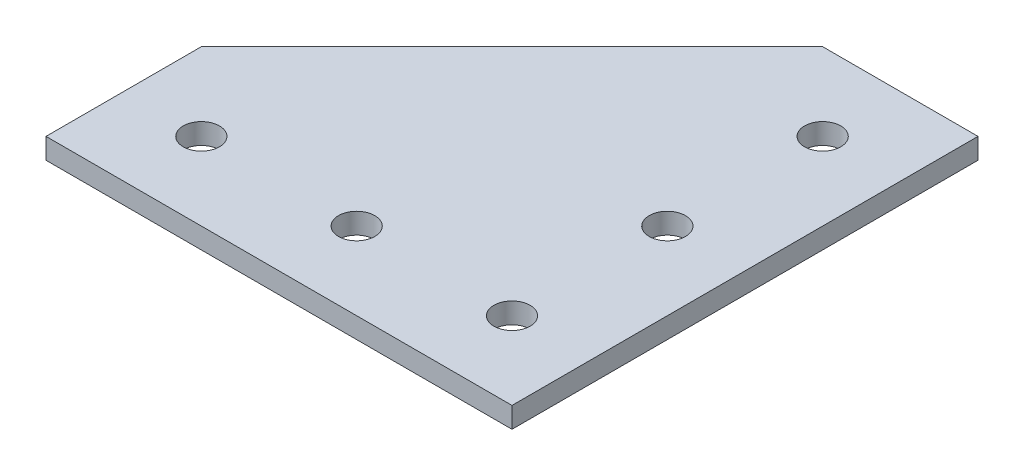
ISO-10303-21;
HEADER;
FILE_DESCRIPTION(('STEP AP214'),'2;1');
FILE_NAME('part.step','',(''),(''),'','','');
FILE_SCHEMA(('AUTOMOTIVE_DESIGN { 1 0 10303 214 1 1 1 1 }'));
ENDSEC;
DATA;
#1=APPLICATION_CONTEXT('core data for automotive mechanical design processes');
#2=APPLICATION_PROTOCOL_DEFINITION('international standard','automotive_design',2000,#1);
#3=PRODUCT_CONTEXT('',#1,'mechanical');
#4=PRODUCT('Part','Part','',(#3));
#5=PRODUCT_RELATED_PRODUCT_CATEGORY('part','',(#4));
#6=PRODUCT_DEFINITION_FORMATION('','',#4);
#7=PRODUCT_DEFINITION_CONTEXT('part definition',#1,'design');
#8=PRODUCT_DEFINITION('design','',#6,#7);
#9=PRODUCT_DEFINITION_SHAPE('','',#8);
#10=(LENGTH_UNIT() NAMED_UNIT(*) SI_UNIT(.MILLI.,.METRE.));
#11=(NAMED_UNIT(*) PLANE_ANGLE_UNIT() SI_UNIT($,.RADIAN.));
#12=(NAMED_UNIT(*) SI_UNIT($,.STERADIAN.) SOLID_ANGLE_UNIT());
#13=UNCERTAINTY_MEASURE_WITH_UNIT(LENGTH_MEASURE(1.E-05),#10,'distance_accuracy_value','');
#14=(GEOMETRIC_REPRESENTATION_CONTEXT(3) GLOBAL_UNCERTAINTY_ASSIGNED_CONTEXT((#13)) GLOBAL_UNIT_ASSIGNED_CONTEXT((#10,
#11,#12)) REPRESENTATION_CONTEXT('',''));
#15=CARTESIAN_POINT('',(0.,0.,0.));
#16=DIRECTION('',(0.,0.,1.));
#17=DIRECTION('',(1.,0.,0.));
#18=AXIS2_PLACEMENT_3D('',#15,#16,#17);
#19=CARTESIAN_POINT('',(-90.,4.,-30.));
#20=DIRECTION('',(0.707106781186548,0.,0.707106781186547));
#21=DIRECTION('',(0.707106781186547,0.,-0.707106781186548));
#22=AXIS2_PLACEMENT_3D('',#19,#20,#21);
#23=PLANE('',#22);
#24=DIRECTION('',(-0.707106781186547,0.,0.707106781186548));
#25=VECTOR('',#24,1.);
#26=CARTESIAN_POINT('',(-90.,0.,-30.));
#27=LINE('',#26,#25);
#28=CARTESIAN_POINT('',(-30.,0.,-90.));
#29=VERTEX_POINT('',#28);
#30=CARTESIAN_POINT('',(-90.,0.,-30.));
#31=VERTEX_POINT('',#30);
#32=EDGE_CURVE('E111',#29,#31,#27,.T.);
#33=ORIENTED_EDGE('',*,*,#32,.T.);
#34=DIRECTION('',(0.,-1.,0.));
#35=VECTOR('',#34,1.);
#36=CARTESIAN_POINT('',(-90.,4.,-30.));
#37=LINE('',#36,#35);
#38=CARTESIAN_POINT('',(-90.,4.,-30.));
#39=VERTEX_POINT('',#38);
#40=EDGE_CURVE('E11',#39,#31,#37,.T.);
#41=ORIENTED_EDGE('',*,*,#40,.F.);
#42=DIRECTION('',(-0.707106781186547,0.,0.707106781186548));
#43=VECTOR('',#42,1.);
#44=CARTESIAN_POINT('',(-90.,4.,-30.));
#45=LINE('',#44,#43);
#46=CARTESIAN_POINT('',(-30.,4.,-90.));
#47=VERTEX_POINT('',#46);
#48=EDGE_CURVE('E120',#47,#39,#45,.T.);
#49=ORIENTED_EDGE('',*,*,#48,.F.);
#50=DIRECTION('',(0.,-1.,0.));
#51=VECTOR('',#50,1.);
#52=CARTESIAN_POINT('',(-30.,4.,-90.));
#53=LINE('',#52,#51);
#54=EDGE_CURVE('E107',#47,#29,#53,.T.);
#55=ORIENTED_EDGE('',*,*,#54,.T.);
#56=EDGE_LOOP('',(#33,#41,#49,#55));
#57=FACE_BOUND('',#56,.T.);
#58=ADVANCED_FACE('F37',(#57),#23,.F.);
#59=CARTESIAN_POINT('',(-90.,4.,0.));
#60=DIRECTION('',(1.,0.,0.));
#61=DIRECTION('',(0.,0.,-1.));
#62=AXIS2_PLACEMENT_3D('',#59,#60,#61);
#63=PLANE('',#62);
#64=DIRECTION('',(0.,0.,1.));
#65=VECTOR('',#64,1.);
#66=CARTESIAN_POINT('',(-90.,0.,0.));
#67=LINE('',#66,#65);
#68=CARTESIAN_POINT('',(-90.,0.,0.));
#69=VERTEX_POINT('',#68);
#70=EDGE_CURVE('E114',#31,#69,#67,.T.);
#71=ORIENTED_EDGE('',*,*,#70,.T.);
#72=DIRECTION('',(0.,-1.,0.));
#73=VECTOR('',#72,1.);
#74=CARTESIAN_POINT('',(-90.,4.,0.));
#75=LINE('',#74,#73);
#76=CARTESIAN_POINT('',(-90.,4.,0.));
#77=VERTEX_POINT('',#76);
#78=EDGE_CURVE('E45',#77,#69,#75,.T.);
#79=ORIENTED_EDGE('',*,*,#78,.F.);
#80=DIRECTION('',(0.,0.,1.));
#81=VECTOR('',#80,1.);
#82=CARTESIAN_POINT('',(-90.,4.,0.));
#83=LINE('',#82,#81);
#84=EDGE_CURVE('E87',#39,#77,#83,.T.);
#85=ORIENTED_EDGE('',*,*,#84,.F.);
#86=ORIENTED_EDGE('',*,*,#40,.T.);
#87=EDGE_LOOP('',(#71,#79,#85,#86));
#88=FACE_BOUND('',#87,.T.);
#89=ADVANCED_FACE('F140',(#88),#63,.F.);
#90=CARTESIAN_POINT('',(0.,4.,0.));
#91=DIRECTION('',(0.,0.,-1.));
#92=DIRECTION('',(-1.,0.,0.));
#93=AXIS2_PLACEMENT_3D('',#90,#91,#92);
#94=PLANE('',#93);
#95=DIRECTION('',(1.,0.,0.));
#96=VECTOR('',#95,1.);
#97=CARTESIAN_POINT('',(0.,0.,0.));
#98=LINE('',#97,#96);
#99=CARTESIAN_POINT('',(0.,0.,0.));
#100=VERTEX_POINT('',#99);
#101=EDGE_CURVE('E102',#69,#100,#98,.T.);
#102=ORIENTED_EDGE('',*,*,#101,.T.);
#103=DIRECTION('',(0.,-1.,0.));
#104=VECTOR('',#103,1.);
#105=CARTESIAN_POINT('',(0.,4.,0.));
#106=LINE('',#105,#104);
#107=CARTESIAN_POINT('',(0.,4.,0.));
#108=VERTEX_POINT('',#107);
#109=EDGE_CURVE('E99',#108,#100,#106,.T.);
#110=ORIENTED_EDGE('',*,*,#109,.F.);
#111=DIRECTION('',(1.,0.,0.));
#112=VECTOR('',#111,1.);
#113=CARTESIAN_POINT('',(0.,4.,0.));
#114=LINE('',#113,#112);
#115=EDGE_CURVE('E91',#77,#108,#114,.T.);
#116=ORIENTED_EDGE('',*,*,#115,.F.);
#117=ORIENTED_EDGE('',*,*,#78,.T.);
#118=EDGE_LOOP('',(#102,#110,#116,#117));
#119=FACE_BOUND('',#118,.T.);
#120=ADVANCED_FACE('F100',(#119),#94,.F.);
#121=CARTESIAN_POINT('',(0.,4.,0.));
#122=DIRECTION('',(-1.,0.,0.));
#123=DIRECTION('',(0.,0.,1.));
#124=AXIS2_PLACEMENT_3D('',#121,#122,#123);
#125=PLANE('',#124);
#126=DIRECTION('',(0.,0.,-1.));
#127=VECTOR('',#126,1.);
#128=CARTESIAN_POINT('',(0.,0.,0.));
#129=LINE('',#128,#127);
#130=CARTESIAN_POINT('',(0.,0.,-90.));
#131=VERTEX_POINT('',#130);
#132=EDGE_CURVE('E73',#100,#131,#129,.T.);
#133=ORIENTED_EDGE('',*,*,#132,.T.);
#134=DIRECTION('',(0.,-1.,0.));
#135=VECTOR('',#134,1.);
#136=CARTESIAN_POINT('',(0.,4.,-90.));
#137=LINE('',#136,#135);
#138=CARTESIAN_POINT('',(0.,4.,-90.));
#139=VERTEX_POINT('',#138);
#140=EDGE_CURVE('E103',#139,#131,#137,.T.);
#141=ORIENTED_EDGE('',*,*,#140,.F.);
#142=DIRECTION('',(0.,0.,-1.));
#143=VECTOR('',#142,1.);
#144=CARTESIAN_POINT('',(0.,4.,0.));
#145=LINE('',#144,#143);
#146=EDGE_CURVE('E95',#108,#139,#145,.T.);
#147=ORIENTED_EDGE('',*,*,#146,.F.);
#148=ORIENTED_EDGE('',*,*,#109,.T.);
#149=EDGE_LOOP('',(#133,#141,#147,#148));
#150=FACE_BOUND('',#149,.T.);
#151=ADVANCED_FACE('F105',(#150),#125,.F.);
#152=CARTESIAN_POINT('',(-30.,4.,-90.));
#153=DIRECTION('',(0.,0.,1.));
#154=DIRECTION('',(1.,0.,0.));
#155=AXIS2_PLACEMENT_3D('',#152,#153,#154);
#156=PLANE('',#155);
#157=DIRECTION('',(-1.,0.,0.));
#158=VECTOR('',#157,1.);
#159=CARTESIAN_POINT('',(-30.,0.,-90.));
#160=LINE('',#159,#158);
#161=EDGE_CURVE('E79',#131,#29,#160,.T.);
#162=ORIENTED_EDGE('',*,*,#161,.T.);
#163=ORIENTED_EDGE('',*,*,#54,.F.);
#164=DIRECTION('',(-1.,0.,0.));
#165=VECTOR('',#164,1.);
#166=CARTESIAN_POINT('',(-30.,4.,-90.));
#167=LINE('',#166,#165);
#168=EDGE_CURVE('E53',#139,#47,#167,.T.);
#169=ORIENTED_EDGE('',*,*,#168,.F.);
#170=ORIENTED_EDGE('',*,*,#140,.T.);
#171=EDGE_LOOP('',(#162,#163,#169,#170));
#172=FACE_BOUND('',#171,.T.);
#173=ADVANCED_FACE('F128',(#172),#156,.F.);
#174=CARTESIAN_POINT('',(0.,4.,0.));
#175=DIRECTION('',(0.,-1.,0.));
#176=DIRECTION('',(0.,0.,-1.));
#177=AXIS2_PLACEMENT_3D('',#174,#175,#176);
#178=PLANE('',#177);
#179=CARTESIAN_POINT('',(-75.,4.,-15.));
#180=DIRECTION('',(0.,1.,0.));
#181=DIRECTION('',(0.,0.,1.));
#182=AXIS2_PLACEMENT_3D('',#179,#180,#181);
#183=CIRCLE('',#182,3.49999999999999);
#184=CARTESIAN_POINT('',(-75.,4.,-11.5));
#185=VERTEX_POINT('',#184);
#186=EDGE_CURVE('E232',#185,#185,#183,.T.);
#187=ORIENTED_EDGE('',*,*,#186,.F.);
#188=EDGE_LOOP('',(#187));
#189=FACE_BOUND('',#188,.T.);
#190=CARTESIAN_POINT('',(-45.,4.,-15.));
#191=DIRECTION('',(0.,1.,0.));
#192=DIRECTION('',(0.,0.,1.));
#193=AXIS2_PLACEMENT_3D('',#190,#191,#192);
#194=CIRCLE('',#193,3.49999999999999);
#195=CARTESIAN_POINT('',(-45.,4.,-11.5));
#196=VERTEX_POINT('',#195);
#197=EDGE_CURVE('E234',#196,#196,#194,.T.);
#198=ORIENTED_EDGE('',*,*,#197,.F.);
#199=EDGE_LOOP('',(#198));
#200=FACE_BOUND('',#199,.T.);
#201=CARTESIAN_POINT('',(-15.,4.,-15.));
#202=DIRECTION('',(0.,1.,0.));
#203=DIRECTION('',(0.,0.,1.));
#204=AXIS2_PLACEMENT_3D('',#201,#202,#203);
#205=CIRCLE('',#204,3.49999999999999);
#206=CARTESIAN_POINT('',(-15.,4.,-11.5));
#207=VERTEX_POINT('',#206);
#208=EDGE_CURVE('E242',#207,#207,#205,.T.);
#209=ORIENTED_EDGE('',*,*,#208,.F.);
#210=EDGE_LOOP('',(#209));
#211=FACE_BOUND('',#210,.T.);
#212=CARTESIAN_POINT('',(-15.,4.,-45.));
#213=DIRECTION('',(0.,1.,0.));
#214=DIRECTION('',(0.,0.,1.));
#215=AXIS2_PLACEMENT_3D('',#212,#213,#214);
#216=CIRCLE('',#215,3.49999999999999);
#217=CARTESIAN_POINT('',(-15.,4.,-41.5));
#218=VERTEX_POINT('',#217);
#219=EDGE_CURVE('E248',#218,#218,#216,.T.);
#220=ORIENTED_EDGE('',*,*,#219,.F.);
#221=EDGE_LOOP('',(#220));
#222=FACE_BOUND('',#221,.T.);
#223=CARTESIAN_POINT('',(-15.,4.,-75.));
#224=DIRECTION('',(0.,1.,0.));
#225=DIRECTION('',(0.,0.,1.));
#226=AXIS2_PLACEMENT_3D('',#223,#224,#225);
#227=CIRCLE('',#226,3.49999999999999);
#228=CARTESIAN_POINT('',(-15.,4.,-71.5));
#229=VERTEX_POINT('',#228);
#230=EDGE_CURVE('E254',#229,#229,#227,.T.);
#231=ORIENTED_EDGE('',*,*,#230,.F.);
#232=EDGE_LOOP('',(#231));
#233=FACE_BOUND('',#232,.T.);
#234=ORIENTED_EDGE('',*,*,#48,.T.);
#235=ORIENTED_EDGE('',*,*,#84,.T.);
#236=ORIENTED_EDGE('',*,*,#115,.T.);
#237=ORIENTED_EDGE('',*,*,#146,.T.);
#238=ORIENTED_EDGE('',*,*,#168,.T.);
#239=EDGE_LOOP('',(#234,#235,#236,#237,#238));
#240=FACE_BOUND('',#239,.T.);
#241=ADVANCED_FACE('F93',(#189,#200,#211,#222,#233,#240),#178,.F.);
#242=CARTESIAN_POINT('',(0.,0.,0.));
#243=DIRECTION('',(0.,-1.,0.));
#244=DIRECTION('',(0.,0.,-1.));
#245=AXIS2_PLACEMENT_3D('',#242,#243,#244);
#246=PLANE('',#245);
#247=CARTESIAN_POINT('',(-75.,0.,-15.));
#248=DIRECTION('',(0.,1.,0.));
#249=DIRECTION('',(0.,0.,1.));
#250=AXIS2_PLACEMENT_3D('',#247,#248,#249);
#251=CIRCLE('',#250,3.5);
#252=CARTESIAN_POINT('',(-75.,0.,-11.5));
#253=VERTEX_POINT('',#252);
#254=EDGE_CURVE('E229',#253,#253,#251,.T.);
#255=ORIENTED_EDGE('',*,*,#254,.T.);
#256=EDGE_LOOP('',(#255));
#257=FACE_BOUND('',#256,.T.);
#258=CARTESIAN_POINT('',(-45.,0.,-15.));
#259=DIRECTION('',(0.,1.,0.));
#260=DIRECTION('',(0.,0.,1.));
#261=AXIS2_PLACEMENT_3D('',#258,#259,#260);
#262=CIRCLE('',#261,3.5);
#263=CARTESIAN_POINT('',(-45.,0.,-11.5));
#264=VERTEX_POINT('',#263);
#265=EDGE_CURVE('E239',#264,#264,#262,.T.);
#266=ORIENTED_EDGE('',*,*,#265,.T.);
#267=EDGE_LOOP('',(#266));
#268=FACE_BOUND('',#267,.T.);
#269=CARTESIAN_POINT('',(-15.,0.,-15.));
#270=DIRECTION('',(0.,1.,0.));
#271=DIRECTION('',(0.,0.,1.));
#272=AXIS2_PLACEMENT_3D('',#269,#270,#271);
#273=CIRCLE('',#272,3.5);
#274=CARTESIAN_POINT('',(-15.,0.,-11.5));
#275=VERTEX_POINT('',#274);
#276=EDGE_CURVE('E245',#275,#275,#273,.T.);
#277=ORIENTED_EDGE('',*,*,#276,.T.);
#278=EDGE_LOOP('',(#277));
#279=FACE_BOUND('',#278,.T.);
#280=CARTESIAN_POINT('',(-15.,0.,-45.));
#281=DIRECTION('',(0.,1.,0.));
#282=DIRECTION('',(0.,0.,1.));
#283=AXIS2_PLACEMENT_3D('',#280,#281,#282);
#284=CIRCLE('',#283,3.5);
#285=CARTESIAN_POINT('',(-15.,0.,-41.5));
#286=VERTEX_POINT('',#285);
#287=EDGE_CURVE('E251',#286,#286,#284,.T.);
#288=ORIENTED_EDGE('',*,*,#287,.T.);
#289=EDGE_LOOP('',(#288));
#290=FACE_BOUND('',#289,.T.);
#291=CARTESIAN_POINT('',(-15.,0.,-75.));
#292=DIRECTION('',(0.,1.,0.));
#293=DIRECTION('',(0.,0.,1.));
#294=AXIS2_PLACEMENT_3D('',#291,#292,#293);
#295=CIRCLE('',#294,3.5);
#296=CARTESIAN_POINT('',(-15.,0.,-71.5));
#297=VERTEX_POINT('',#296);
#298=EDGE_CURVE('E115',#297,#297,#295,.T.);
#299=ORIENTED_EDGE('',*,*,#298,.T.);
#300=EDGE_LOOP('',(#299));
#301=FACE_BOUND('',#300,.T.);
#302=ORIENTED_EDGE('',*,*,#32,.F.);
#303=ORIENTED_EDGE('',*,*,#161,.F.);
#304=ORIENTED_EDGE('',*,*,#132,.F.);
#305=ORIENTED_EDGE('',*,*,#101,.F.);
#306=ORIENTED_EDGE('',*,*,#70,.F.);
#307=EDGE_LOOP('',(#302,#303,#304,#305,#306));
#308=FACE_BOUND('',#307,.T.);
#309=ADVANCED_FACE('F124',(#257,#268,#279,#290,#301,#308),#246,.T.);
#310=CARTESIAN_POINT('',(-15.,4.,-75.));
#311=DIRECTION('',(0.,1.,0.));
#312=DIRECTION('',(0.,0.,1.));
#313=AXIS2_PLACEMENT_3D('',#310,#311,#312);
#314=CYLINDRICAL_SURFACE('',#313,3.49999999999999);
#315=ORIENTED_EDGE('',*,*,#298,.F.);
#316=EDGE_LOOP('',(#315));
#317=FACE_BOUND('',#316,.T.);
#318=ORIENTED_EDGE('',*,*,#230,.T.);
#319=EDGE_LOOP('',(#318));
#320=FACE_BOUND('',#319,.T.);
#321=ADVANCED_FACE('F173',(#317,#320),#314,.F.);
#322=CARTESIAN_POINT('',(-15.,4.,-45.));
#323=DIRECTION('',(0.,1.,0.));
#324=DIRECTION('',(0.,0.,1.));
#325=AXIS2_PLACEMENT_3D('',#322,#323,#324);
#326=CYLINDRICAL_SURFACE('',#325,3.49999999999999);
#327=ORIENTED_EDGE('',*,*,#287,.F.);
#328=EDGE_LOOP('',(#327));
#329=FACE_BOUND('',#328,.T.);
#330=ORIENTED_EDGE('',*,*,#219,.T.);
#331=EDGE_LOOP('',(#330));
#332=FACE_BOUND('',#331,.T.);
#333=ADVANCED_FACE('F182',(#329,#332),#326,.F.);
#334=CARTESIAN_POINT('',(-15.,4.,-15.));
#335=DIRECTION('',(0.,1.,0.));
#336=DIRECTION('',(0.,0.,1.));
#337=AXIS2_PLACEMENT_3D('',#334,#335,#336);
#338=CYLINDRICAL_SURFACE('',#337,3.49999999999999);
#339=ORIENTED_EDGE('',*,*,#276,.F.);
#340=EDGE_LOOP('',(#339));
#341=FACE_BOUND('',#340,.T.);
#342=ORIENTED_EDGE('',*,*,#208,.T.);
#343=EDGE_LOOP('',(#342));
#344=FACE_BOUND('',#343,.T.);
#345=ADVANCED_FACE('F192',(#341,#344),#338,.F.);
#346=CARTESIAN_POINT('',(-45.,4.,-15.));
#347=DIRECTION('',(0.,1.,0.));
#348=DIRECTION('',(0.,0.,1.));
#349=AXIS2_PLACEMENT_3D('',#346,#347,#348);
#350=CYLINDRICAL_SURFACE('',#349,3.49999999999999);
#351=ORIENTED_EDGE('',*,*,#265,.F.);
#352=EDGE_LOOP('',(#351));
#353=FACE_BOUND('',#352,.T.);
#354=ORIENTED_EDGE('',*,*,#197,.T.);
#355=EDGE_LOOP('',(#354));
#356=FACE_BOUND('',#355,.T.);
#357=ADVANCED_FACE('F202',(#353,#356),#350,.F.);
#358=CARTESIAN_POINT('',(-75.,4.,-15.));
#359=DIRECTION('',(0.,1.,0.));
#360=DIRECTION('',(0.,0.,1.));
#361=AXIS2_PLACEMENT_3D('',#358,#359,#360);
#362=CYLINDRICAL_SURFACE('',#361,3.5);
#363=ORIENTED_EDGE('',*,*,#254,.F.);
#364=EDGE_LOOP('',(#363));
#365=FACE_BOUND('',#364,.T.);
#366=ORIENTED_EDGE('',*,*,#186,.T.);
#367=EDGE_LOOP('',(#366));
#368=FACE_BOUND('',#367,.T.);
#369=ADVANCED_FACE('F212',(#365,#368),#362,.F.);
#370=CLOSED_SHELL('',(#58,#89,#120,#151,#173,#241,#309,#321,#333,#345,#357,#369));
#371=MANIFOLD_SOLID_BREP('B2',#370);
#372=ADVANCED_BREP_SHAPE_REPRESENTATION('',(#18,#371),#14);
#373=SHAPE_DEFINITION_REPRESENTATION(#9,#372);
ENDSEC;
END-ISO-10303-21;
